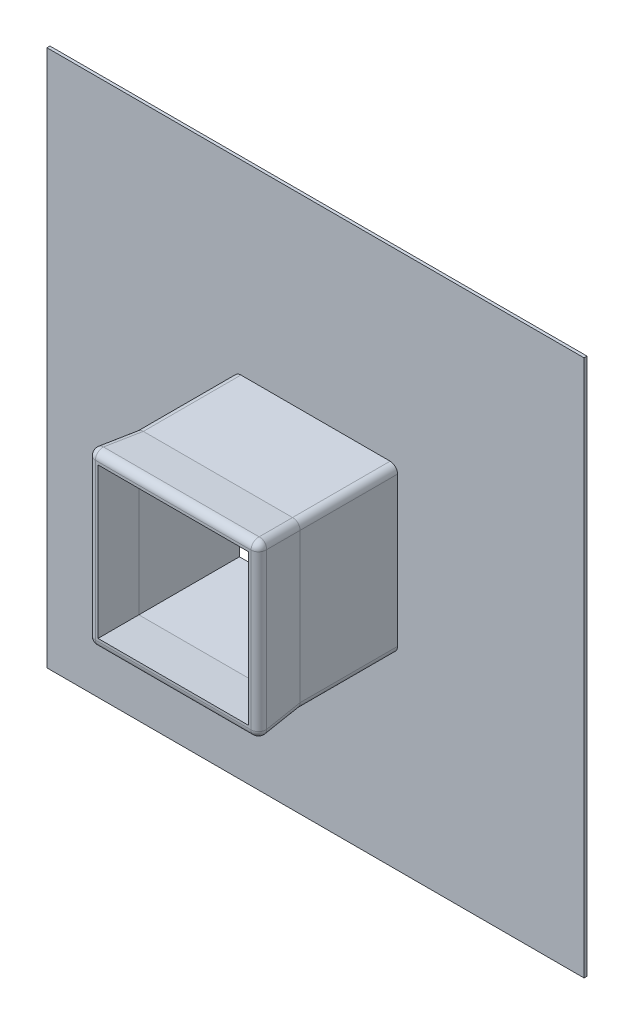
ISO-10303-21;
HEADER;
FILE_DESCRIPTION(('STEP AP214'),'2;1');
FILE_NAME('part.step','',(''),(''),'','','');
FILE_SCHEMA(('AUTOMOTIVE_DESIGN { 1 0 10303 214 1 1 1 1 }'));
ENDSEC;
DATA;
#1=APPLICATION_CONTEXT('core data for automotive mechanical design processes');
#2=APPLICATION_PROTOCOL_DEFINITION('international standard','automotive_design',2000,#1);
#3=PRODUCT_CONTEXT('',#1,'mechanical');
#4=PRODUCT('Part','Part','',(#3));
#5=PRODUCT_RELATED_PRODUCT_CATEGORY('part','',(#4));
#6=PRODUCT_DEFINITION_FORMATION('','',#4);
#7=PRODUCT_DEFINITION_CONTEXT('part definition',#1,'design');
#8=PRODUCT_DEFINITION('design','',#6,#7);
#9=PRODUCT_DEFINITION_SHAPE('','',#8);
#10=(LENGTH_UNIT() NAMED_UNIT(*) SI_UNIT(.MILLI.,.METRE.));
#11=(NAMED_UNIT(*) PLANE_ANGLE_UNIT() SI_UNIT($,.RADIAN.));
#12=(NAMED_UNIT(*) SI_UNIT($,.STERADIAN.) SOLID_ANGLE_UNIT());
#13=UNCERTAINTY_MEASURE_WITH_UNIT(LENGTH_MEASURE(1.E-05),#10,'distance_accuracy_value','');
#14=(GEOMETRIC_REPRESENTATION_CONTEXT(3) GLOBAL_UNCERTAINTY_ASSIGNED_CONTEXT((#13)) GLOBAL_UNIT_ASSIGNED_CONTEXT((#10,
#11,#12)) REPRESENTATION_CONTEXT('',''));
#15=CARTESIAN_POINT('',(0.,0.,0.));
#16=DIRECTION('',(0.,0.,1.));
#17=DIRECTION('',(1.,0.,0.));
#18=AXIS2_PLACEMENT_3D('',#15,#16,#17);
#19=CARTESIAN_POINT('',(-9.386230559438,-9.38623055943905,38.2643458776388));
#20=DIRECTION('',(1.,0.,0.));
#21=DIRECTION('',(0.,0.,-1.));
#22=AXIS2_PLACEMENT_3D('',#19,#20,#21);
#23=PLANE('',#22);
#24=DIRECTION('',(0.,-1.,0.));
#25=VECTOR('',#24,1.);
#26=CARTESIAN_POINT('',(-9.386230559438,-9.38623055943905,36.2643458776388));
#27=LINE('',#26,#25);
#28=CARTESIAN_POINT('',(-9.386230559438,350.613769439746,36.2643458776388));
#29=VERTEX_POINT('',#28);
#30=CARTESIAN_POINT('',(-9.386230559438,-9.38623055943905,36.2643458776388));
#31=VERTEX_POINT('',#30);
#32=EDGE_CURVE('E282',#29,#31,#27,.T.);
#33=ORIENTED_EDGE('',*,*,#32,.T.);
#34=DIRECTION('',(0.,0.,-1.));
#35=VECTOR('',#34,1.);
#36=CARTESIAN_POINT('',(-9.386230559438,-9.38623055943905,38.2643458776388));
#37=LINE('',#36,#35);
#38=CARTESIAN_POINT('',(-9.386230559438,-9.38623055943905,38.2643458776388));
#39=VERTEX_POINT('',#38);
#40=EDGE_CURVE('E309',#39,#31,#37,.T.);
#41=ORIENTED_EDGE('',*,*,#40,.F.);
#42=DIRECTION('',(0.,-1.,0.));
#43=VECTOR('',#42,1.);
#44=CARTESIAN_POINT('',(-9.386230559438,-9.38623055943905,38.2643458776388));
#45=LINE('',#44,#43);
#46=CARTESIAN_POINT('',(-9.386230559438,350.613769439746,38.2643458776388));
#47=VERTEX_POINT('',#46);
#48=EDGE_CURVE('E283',#47,#39,#45,.T.);
#49=ORIENTED_EDGE('',*,*,#48,.F.);
#50=DIRECTION('',(0.,0.,-1.));
#51=VECTOR('',#50,1.);
#52=CARTESIAN_POINT('',(-9.386230559438,350.613769439746,38.2643458776388));
#53=LINE('',#52,#51);
#54=EDGE_CURVE('E293',#47,#29,#53,.T.);
#55=ORIENTED_EDGE('',*,*,#54,.T.);
#56=EDGE_LOOP('',(#33,#41,#49,#55));
#57=FACE_BOUND('',#56,.T.);
#58=ADVANCED_FACE('F39',(#57),#23,.F.);
#59=CARTESIAN_POINT('',(-9.386230559438,-9.38623055943905,38.2643458776388));
#60=DIRECTION('',(0.,1.,0.));
#61=DIRECTION('',(0.,0.,1.));
#62=AXIS2_PLACEMENT_3D('',#59,#60,#61);
#63=PLANE('',#62);
#64=DIRECTION('',(1.,0.,0.));
#65=VECTOR('',#64,1.);
#66=CARTESIAN_POINT('',(-9.386230559438,-9.38623055943905,36.2643458776388));
#67=LINE('',#66,#65);
#68=CARTESIAN_POINT('',(350.613769439747,-9.38623055943905,36.2643458776388));
#69=VERTEX_POINT('',#68);
#70=EDGE_CURVE('E296',#31,#69,#67,.T.);
#71=ORIENTED_EDGE('',*,*,#70,.T.);
#72=DIRECTION('',(0.,0.,-1.));
#73=VECTOR('',#72,1.);
#74=CARTESIAN_POINT('',(350.613769439747,-9.38623055943905,38.2643458776388));
#75=LINE('',#74,#73);
#76=CARTESIAN_POINT('',(350.613769439747,-9.38623055943905,38.2643458776388));
#77=VERTEX_POINT('',#76);
#78=EDGE_CURVE('E306',#77,#69,#75,.T.);
#79=ORIENTED_EDGE('',*,*,#78,.F.);
#80=DIRECTION('',(1.,0.,0.));
#81=VECTOR('',#80,1.);
#82=CARTESIAN_POINT('',(-9.386230559438,-9.38623055943905,38.2643458776388));
#83=LINE('',#82,#81);
#84=EDGE_CURVE('E286',#39,#77,#83,.T.);
#85=ORIENTED_EDGE('',*,*,#84,.F.);
#86=ORIENTED_EDGE('',*,*,#40,.T.);
#87=EDGE_LOOP('',(#71,#79,#85,#86));
#88=FACE_BOUND('',#87,.T.);
#89=ADVANCED_FACE('F559',(#88),#63,.F.);
#90=CARTESIAN_POINT('',(350.613769439747,-9.38623055943905,38.2643458776388));
#91=DIRECTION('',(-1.,0.,0.));
#92=DIRECTION('',(0.,0.,1.));
#93=AXIS2_PLACEMENT_3D('',#90,#91,#92);
#94=PLANE('',#93);
#95=DIRECTION('',(0.,1.,0.));
#96=VECTOR('',#95,1.);
#97=CARTESIAN_POINT('',(350.613769439747,-9.38623055943905,36.2643458776388));
#98=LINE('',#97,#96);
#99=CARTESIAN_POINT('',(350.613769439747,350.613769439746,36.2643458776388));
#100=VERTEX_POINT('',#99);
#101=EDGE_CURVE('E298',#69,#100,#98,.T.);
#102=ORIENTED_EDGE('',*,*,#101,.T.);
#103=DIRECTION('',(0.,0.,-1.));
#104=VECTOR('',#103,1.);
#105=CARTESIAN_POINT('',(350.613769439747,350.613769439746,38.2643458776388));
#106=LINE('',#105,#104);
#107=CARTESIAN_POINT('',(350.613769439747,350.613769439746,38.2643458776388));
#108=VERTEX_POINT('',#107);
#109=EDGE_CURVE('E303',#108,#100,#106,.T.);
#110=ORIENTED_EDGE('',*,*,#109,.F.);
#111=DIRECTION('',(0.,1.,0.));
#112=VECTOR('',#111,1.);
#113=CARTESIAN_POINT('',(350.613769439747,-9.38623055943905,38.2643458776388));
#114=LINE('',#113,#112);
#115=EDGE_CURVE('E289',#77,#108,#114,.T.);
#116=ORIENTED_EDGE('',*,*,#115,.F.);
#117=ORIENTED_EDGE('',*,*,#78,.T.);
#118=EDGE_LOOP('',(#102,#110,#116,#117));
#119=FACE_BOUND('',#118,.T.);
#120=ADVANCED_FACE('F565',(#119),#94,.F.);
#121=CARTESIAN_POINT('',(-9.386230559438,350.613769439746,38.2643458776388));
#122=DIRECTION('',(0.,-1.,0.));
#123=DIRECTION('',(0.,0.,-1.));
#124=AXIS2_PLACEMENT_3D('',#121,#122,#123);
#125=PLANE('',#124);
#126=DIRECTION('',(-1.,0.,0.));
#127=VECTOR('',#126,1.);
#128=CARTESIAN_POINT('',(-9.386230559438,350.613769439746,36.2643458776388));
#129=LINE('',#128,#127);
#130=EDGE_CURVE('E287',#100,#29,#129,.T.);
#131=ORIENTED_EDGE('',*,*,#130,.T.);
#132=ORIENTED_EDGE('',*,*,#54,.F.);
#133=DIRECTION('',(-1.,0.,0.));
#134=VECTOR('',#133,1.);
#135=CARTESIAN_POINT('',(-9.386230559438,350.613769439746,38.2643458776388));
#136=LINE('',#135,#134);
#137=EDGE_CURVE('E291',#108,#47,#136,.T.);
#138=ORIENTED_EDGE('',*,*,#137,.F.);
#139=ORIENTED_EDGE('',*,*,#109,.T.);
#140=EDGE_LOOP('',(#131,#132,#138,#139));
#141=FACE_BOUND('',#140,.T.);
#142=ADVANCED_FACE('F747',(#141),#125,.F.);
#143=CARTESIAN_POINT('',(0.,0.,38.2643458776388));
#144=DIRECTION('',(0.,0.,-1.));
#145=DIRECTION('',(-1.,0.,0.));
#146=AXIS2_PLACEMENT_3D('',#143,#144,#145);
#147=PLANE('',#146);
#148=DIRECTION('',(-1.,0.,0.));
#149=VECTOR('',#148,1.);
#150=CARTESIAN_POINT('',(115.613769764681,225.613769439751,38.2643458776388));
#151=LINE('',#150,#149);
#152=CARTESIAN_POINT('',(220.613769764689,225.613769439751,38.2643458776388));
#153=VERTEX_POINT('',#152);
#154=CARTESIAN_POINT('',(120.613769764688,225.613769439751,38.2643458776388));
#155=VERTEX_POINT('',#154);
#156=EDGE_CURVE('E272',#153,#155,#151,.T.);
#157=ORIENTED_EDGE('',*,*,#156,.F.);
#158=CARTESIAN_POINT('',(220.613769764689,220.613769439751,38.2643458776388));
#159=DIRECTION('',(0.,0.,-1.));
#160=DIRECTION('',(-1.,0.,0.));
#161=AXIS2_PLACEMENT_3D('',#158,#159,#160);
#162=CIRCLE('',#161,5.);
#163=CARTESIAN_POINT('',(225.613769764681,220.613769439751,38.2643458776388));
#164=VERTEX_POINT('',#163);
#165=EDGE_CURVE('E398',#153,#164,#162,.T.);
#166=ORIENTED_EDGE('',*,*,#165,.T.);
#167=DIRECTION('',(0.,1.,0.));
#168=VECTOR('',#167,1.);
#169=CARTESIAN_POINT('',(225.613769764681,225.613769439751,38.2643458776388));
#170=LINE('',#169,#168);
#171=CARTESIAN_POINT('',(225.613769764681,120.613769439751,38.2643458776388));
#172=VERTEX_POINT('',#171);
#173=EDGE_CURVE('E269',#172,#164,#170,.T.);
#174=ORIENTED_EDGE('',*,*,#173,.F.);
#175=CARTESIAN_POINT('',(220.613769764689,120.613769439751,38.2643458776388));
#176=DIRECTION('',(0.,0.,-1.));
#177=DIRECTION('',(-1.,0.,0.));
#178=AXIS2_PLACEMENT_3D('',#175,#176,#177);
#179=CIRCLE('',#178,5.);
#180=CARTESIAN_POINT('',(220.613769764689,115.613769439751,38.2643458776388));
#181=VERTEX_POINT('',#180);
#182=EDGE_CURVE('E418',#172,#181,#179,.T.);
#183=ORIENTED_EDGE('',*,*,#182,.T.);
#184=DIRECTION('',(1.,0.,0.));
#185=VECTOR('',#184,1.);
#186=CARTESIAN_POINT('',(115.613769764681,115.613769439751,38.2643458776388));
#187=LINE('',#186,#185);
#188=CARTESIAN_POINT('',(120.613769764688,115.613769439751,38.2643458776388));
#189=VERTEX_POINT('',#188);
#190=EDGE_CURVE('E279',#189,#181,#187,.T.);
#191=ORIENTED_EDGE('',*,*,#190,.F.);
#192=CARTESIAN_POINT('',(120.613769764688,120.613769439751,38.2643458776388));
#193=DIRECTION('',(0.,0.,-1.));
#194=DIRECTION('',(-1.,0.,0.));
#195=AXIS2_PLACEMENT_3D('',#192,#193,#194);
#196=CIRCLE('',#195,5.);
#197=CARTESIAN_POINT('',(115.613769764681,120.613769439751,38.2643458776388));
#198=VERTEX_POINT('',#197);
#199=EDGE_CURVE('E428',#189,#198,#196,.T.);
#200=ORIENTED_EDGE('',*,*,#199,.T.);
#201=DIRECTION('',(0.,-1.,0.));
#202=VECTOR('',#201,1.);
#203=CARTESIAN_POINT('',(115.613769764681,225.613769439751,38.2643458776388));
#204=LINE('',#203,#202);
#205=CARTESIAN_POINT('',(115.613769764681,220.613769439751,38.2643458776388));
#206=VERTEX_POINT('',#205);
#207=EDGE_CURVE('E276',#206,#198,#204,.T.);
#208=ORIENTED_EDGE('',*,*,#207,.F.);
#209=CARTESIAN_POINT('',(120.613769764688,220.613769439751,38.2643458776388));
#210=DIRECTION('',(0.,0.,-1.));
#211=DIRECTION('',(-1.,0.,0.));
#212=AXIS2_PLACEMENT_3D('',#209,#210,#211);
#213=CIRCLE('',#212,5.);
#214=EDGE_CURVE('E408',#206,#155,#213,.T.);
#215=ORIENTED_EDGE('',*,*,#214,.T.);
#216=EDGE_LOOP('',(#157,#166,#174,#183,#191,#200,#208,#215));
#217=FACE_BOUND('',#216,.T.);
#218=ORIENTED_EDGE('',*,*,#48,.T.);
#219=ORIENTED_EDGE('',*,*,#84,.T.);
#220=ORIENTED_EDGE('',*,*,#115,.T.);
#221=ORIENTED_EDGE('',*,*,#137,.T.);
#222=EDGE_LOOP('',(#218,#219,#220,#221));
#223=FACE_BOUND('',#222,.T.);
#224=ADVANCED_FACE('F524',(#217,#223),#147,.F.);
#225=CARTESIAN_POINT('',(0.,0.,36.2643458776388));
#226=DIRECTION('',(0.,0.,-1.));
#227=DIRECTION('',(-1.,0.,0.));
#228=AXIS2_PLACEMENT_3D('',#225,#226,#227);
#229=PLANE('',#228);
#230=ORIENTED_EDGE('',*,*,#32,.F.);
#231=ORIENTED_EDGE('',*,*,#130,.F.);
#232=ORIENTED_EDGE('',*,*,#101,.F.);
#233=ORIENTED_EDGE('',*,*,#70,.F.);
#234=EDGE_LOOP('',(#230,#231,#232,#233));
#235=FACE_BOUND('',#234,.T.);
#236=DIRECTION('',(-1.,0.,0.));
#237=VECTOR('',#236,1.);
#238=CARTESIAN_POINT('',(223.613769764689,117.613769439751,36.2643458776388));
#239=LINE('',#238,#237);
#240=CARTESIAN_POINT('',(223.613769764689,117.613769439751,36.2643458776388));
#241=VERTEX_POINT('',#240);
#242=CARTESIAN_POINT('',(117.613769764688,117.613769439751,36.2643458776388));
#243=VERTEX_POINT('',#242);
#244=EDGE_CURVE('E451',#241,#243,#239,.T.);
#245=ORIENTED_EDGE('',*,*,#244,.F.);
#246=DIRECTION('',(0.,-1.,0.));
#247=VECTOR('',#246,1.);
#248=CARTESIAN_POINT('',(223.613769764689,117.613769439751,36.2643458776388));
#249=LINE('',#248,#247);
#250=CARTESIAN_POINT('',(223.613769764689,223.613769439751,36.2643458776388));
#251=VERTEX_POINT('',#250);
#252=EDGE_CURVE('E245',#251,#241,#249,.T.);
#253=ORIENTED_EDGE('',*,*,#252,.F.);
#254=DIRECTION('',(1.,0.,0.));
#255=VECTOR('',#254,1.);
#256=CARTESIAN_POINT('',(223.613769764689,223.613769439751,36.2643458776388));
#257=LINE('',#256,#255);
#258=CARTESIAN_POINT('',(117.613769764688,223.613769439751,36.2643458776388));
#259=VERTEX_POINT('',#258);
#260=EDGE_CURVE('E255',#259,#251,#257,.T.);
#261=ORIENTED_EDGE('',*,*,#260,.F.);
#262=DIRECTION('',(0.,1.,0.));
#263=VECTOR('',#262,1.);
#264=CARTESIAN_POINT('',(117.613769764688,117.613769439751,36.2643458776388));
#265=LINE('',#264,#263);
#266=EDGE_CURVE('E453',#243,#259,#265,.T.);
#267=ORIENTED_EDGE('',*,*,#266,.F.);
#268=EDGE_LOOP('',(#245,#253,#261,#267));
#269=FACE_BOUND('',#268,.T.);
#270=ADVANCED_FACE('F467',(#235,#269),#229,.T.);
#271=CARTESIAN_POINT('',(225.613769764689,225.613769439751,259.22238606523));
#272=DIRECTION('',(0.,1.,0.));
#273=DIRECTION('',(0.,0.,1.));
#274=AXIS2_PLACEMENT_3D('',#271,#272,#273);
#275=PLANE('',#274);
#276=DIRECTION('',(-1.,0.,0.));
#277=VECTOR('',#276,1.);
#278=CARTESIAN_POINT('',(225.613769764689,225.613769439751,103.658894204189));
#279=LINE('',#278,#277);
#280=CARTESIAN_POINT('',(220.613769764689,225.613769439751,103.658894204189));
#281=VERTEX_POINT('',#280);
#282=CARTESIAN_POINT('',(120.613769764688,225.613769439751,103.658894204189));
#283=VERTEX_POINT('',#282);
#284=EDGE_CURVE('E273',#281,#283,#279,.T.);
#285=ORIENTED_EDGE('',*,*,#284,.F.);
#286=DIRECTION('',(0.,0.,-1.));
#287=VECTOR('',#286,1.);
#288=CARTESIAN_POINT('',(220.613769764689,225.613769439751,259.22238606523));
#289=LINE('',#288,#287);
#290=EDGE_CURVE('E380',#281,#153,#289,.T.);
#291=ORIENTED_EDGE('',*,*,#290,.T.);
#292=ORIENTED_EDGE('',*,*,#156,.T.);
#293=DIRECTION('',(0.,0.,-1.));
#294=VECTOR('',#293,1.);
#295=CARTESIAN_POINT('',(120.613769764688,225.613769439751,259.22238606523));
#296=LINE('',#295,#294);
#297=EDGE_CURVE('E344',#155,#283,#296,.F.);
#298=ORIENTED_EDGE('',*,*,#297,.T.);
#299=EDGE_LOOP('',(#285,#291,#292,#298));
#300=FACE_BOUND('',#299,.T.);
#301=ADVANCED_FACE('F522',(#300),#275,.T.);
#302=CARTESIAN_POINT('',(225.613769764689,115.613769439751,259.22238606523));
#303=DIRECTION('',(0.,-1.,0.));
#304=DIRECTION('',(0.,0.,-1.));
#305=AXIS2_PLACEMENT_3D('',#302,#303,#304);
#306=PLANE('',#305);
#307=ORIENTED_EDGE('',*,*,#190,.T.);
#308=DIRECTION('',(0.,0.,-1.));
#309=VECTOR('',#308,1.);
#310=CARTESIAN_POINT('',(220.613769764689,115.613769439751,259.22238606523));
#311=LINE('',#310,#309);
#312=CARTESIAN_POINT('',(220.613769764689,115.613769439751,103.658894204189));
#313=VERTEX_POINT('',#312);
#314=EDGE_CURVE('E396',#181,#313,#311,.F.);
#315=ORIENTED_EDGE('',*,*,#314,.T.);
#316=DIRECTION('',(1.,0.,0.));
#317=VECTOR('',#316,1.);
#318=CARTESIAN_POINT('',(225.613769764689,115.613769439751,103.658894204189));
#319=LINE('',#318,#317);
#320=CARTESIAN_POINT('',(120.613769764688,115.613769439751,103.658894204189));
#321=VERTEX_POINT('',#320);
#322=EDGE_CURVE('E263',#321,#313,#319,.T.);
#323=ORIENTED_EDGE('',*,*,#322,.F.);
#324=DIRECTION('',(0.,0.,-1.));
#325=VECTOR('',#324,1.);
#326=CARTESIAN_POINT('',(120.613769764688,115.613769439751,259.22238606523));
#327=LINE('',#326,#325);
#328=EDGE_CURVE('E393',#321,#189,#327,.T.);
#329=ORIENTED_EDGE('',*,*,#328,.T.);
#330=EDGE_LOOP('',(#307,#315,#323,#329));
#331=FACE_BOUND('',#330,.T.);
#332=ADVANCED_FACE('F442',(#331),#306,.T.);
#333=CARTESIAN_POINT('',(225.613769764689,115.613769439751,259.22238606523));
#334=DIRECTION('',(1.,0.,0.));
#335=DIRECTION('',(0.,0.,-1.));
#336=AXIS2_PLACEMENT_3D('',#333,#334,#335);
#337=PLANE('',#336);
#338=ORIENTED_EDGE('',*,*,#173,.T.);
#339=DIRECTION('',(0.,0.,-1.));
#340=VECTOR('',#339,1.);
#341=CARTESIAN_POINT('',(225.613769764689,220.613769439751,259.22238606523));
#342=LINE('',#341,#340);
#343=CARTESIAN_POINT('',(225.613769764689,220.613769439751,103.658894204189));
#344=VERTEX_POINT('',#343);
#345=EDGE_CURVE('E386',#164,#344,#342,.F.);
#346=ORIENTED_EDGE('',*,*,#345,.T.);
#347=DIRECTION('',(0.,1.,0.));
#348=VECTOR('',#347,1.);
#349=CARTESIAN_POINT('',(225.613769764689,115.613769439751,103.658894204189));
#350=LINE('',#349,#348);
#351=CARTESIAN_POINT('',(225.613769764689,120.613769439751,103.658894204189));
#352=VERTEX_POINT('',#351);
#353=EDGE_CURVE('E259',#352,#344,#350,.T.);
#354=ORIENTED_EDGE('',*,*,#353,.F.);
#355=DIRECTION('',(0.,0.,-1.));
#356=VECTOR('',#355,1.);
#357=CARTESIAN_POINT('',(225.613769764689,120.613769439751,259.22238606523));
#358=LINE('',#357,#356);
#359=EDGE_CURVE('E383',#352,#172,#358,.T.);
#360=ORIENTED_EDGE('',*,*,#359,.T.);
#361=EDGE_LOOP('',(#338,#346,#354,#360));
#362=FACE_BOUND('',#361,.T.);
#363=ADVANCED_FACE('F706',(#362),#337,.T.);
#364=CARTESIAN_POINT('',(115.613769764688,115.613769439751,259.22238606523));
#365=DIRECTION('',(-1.,0.,0.));
#366=DIRECTION('',(0.,-1.,0.));
#367=AXIS2_PLACEMENT_3D('',#364,#365,#366);
#368=PLANE('',#367);
#369=DIRECTION('',(0.,-1.,0.));
#370=VECTOR('',#369,1.);
#371=CARTESIAN_POINT('',(115.613769764688,115.613769439751,103.658894204189));
#372=LINE('',#371,#370);
#373=CARTESIAN_POINT('',(115.613769764688,220.613769439751,103.658894204189));
#374=VERTEX_POINT('',#373);
#375=CARTESIAN_POINT('',(115.613769764688,120.613769439751,103.658894204189));
#376=VERTEX_POINT('',#375);
#377=EDGE_CURVE('E235',#374,#376,#372,.T.);
#378=ORIENTED_EDGE('',*,*,#377,.F.);
#379=DIRECTION('',(0.,0.,-1.));
#380=VECTOR('',#379,1.);
#381=CARTESIAN_POINT('',(115.613769764688,220.613769439751,259.22238606523));
#382=LINE('',#381,#380);
#383=EDGE_CURVE('E390',#374,#206,#382,.T.);
#384=ORIENTED_EDGE('',*,*,#383,.T.);
#385=ORIENTED_EDGE('',*,*,#207,.T.);
#386=DIRECTION('',(0.,0.,-1.));
#387=VECTOR('',#386,1.);
#388=CARTESIAN_POINT('',(115.613769764688,120.613769439751,259.22238606523));
#389=LINE('',#388,#387);
#390=EDGE_CURVE('E388',#198,#376,#389,.F.);
#391=ORIENTED_EDGE('',*,*,#390,.T.);
#392=EDGE_LOOP('',(#378,#384,#385,#391));
#393=FACE_BOUND('',#392,.T.);
#394=ADVANCED_FACE('F530',(#393),#368,.T.);
#395=CARTESIAN_POINT('',(223.613769764689,117.613769439751,259.22238606523));
#396=DIRECTION('',(0.,-1.,0.));
#397=DIRECTION('',(0.,0.,-1.));
#398=AXIS2_PLACEMENT_3D('',#395,#396,#397);
#399=PLANE('',#398);
#400=DIRECTION('',(0.,0.,-1.));
#401=VECTOR('',#400,1.);
#402=CARTESIAN_POINT('',(117.613769764688,117.613769439751,259.22238606523));
#403=LINE('',#402,#401);
#404=CARTESIAN_POINT('',(117.613769764688,117.613769439751,103.658894204189));
#405=VERTEX_POINT('',#404);
#406=EDGE_CURVE('E254',#405,#243,#403,.T.);
#407=ORIENTED_EDGE('',*,*,#406,.F.);
#408=DIRECTION('',(1.,0.,0.));
#409=VECTOR('',#408,1.);
#410=CARTESIAN_POINT('',(223.613769764689,117.613769439751,103.658894204189));
#411=LINE('',#410,#409);
#412=CARTESIAN_POINT('',(223.613769764689,117.613769439751,103.658894204189));
#413=VERTEX_POINT('',#412);
#414=EDGE_CURVE('E241',#405,#413,#411,.T.);
#415=ORIENTED_EDGE('',*,*,#414,.T.);
#416=DIRECTION('',(0.,0.,-1.));
#417=VECTOR('',#416,1.);
#418=CARTESIAN_POINT('',(223.613769764689,117.613769439751,259.22238606523));
#419=LINE('',#418,#417);
#420=EDGE_CURVE('E248',#413,#241,#419,.T.);
#421=ORIENTED_EDGE('',*,*,#420,.T.);
#422=ORIENTED_EDGE('',*,*,#244,.T.);
#423=EDGE_LOOP('',(#407,#415,#421,#422));
#424=FACE_BOUND('',#423,.T.);
#425=ADVANCED_FACE('F258',(#424),#399,.F.);
#426=CARTESIAN_POINT('',(117.613769764688,117.613769439751,259.22238606523));
#427=DIRECTION('',(-1.,0.,0.));
#428=DIRECTION('',(0.,0.,1.));
#429=AXIS2_PLACEMENT_3D('',#426,#427,#428);
#430=PLANE('',#429);
#431=DIRECTION('',(0.,0.,-1.));
#432=VECTOR('',#431,1.);
#433=CARTESIAN_POINT('',(117.613769764688,223.613769439751,259.22238606523));
#434=LINE('',#433,#432);
#435=CARTESIAN_POINT('',(117.613769764688,223.613769439751,103.658894204189));
#436=VERTEX_POINT('',#435);
#437=EDGE_CURVE('E265',#436,#259,#434,.T.);
#438=ORIENTED_EDGE('',*,*,#437,.F.);
#439=DIRECTION('',(0.,-1.,0.));
#440=VECTOR('',#439,1.);
#441=CARTESIAN_POINT('',(117.613769764688,117.613769439751,103.658894204189));
#442=LINE('',#441,#440);
#443=EDGE_CURVE('E465',#436,#405,#442,.T.);
#444=ORIENTED_EDGE('',*,*,#443,.T.);
#445=ORIENTED_EDGE('',*,*,#406,.T.);
#446=ORIENTED_EDGE('',*,*,#266,.T.);
#447=EDGE_LOOP('',(#438,#444,#445,#446));
#448=FACE_BOUND('',#447,.T.);
#449=ADVANCED_FACE('F461',(#448),#430,.F.);
#450=CARTESIAN_POINT('',(223.613769764689,223.613769439751,259.22238606523));
#451=DIRECTION('',(0.,1.,0.));
#452=DIRECTION('',(0.,0.,1.));
#453=AXIS2_PLACEMENT_3D('',#450,#451,#452);
#454=PLANE('',#453);
#455=DIRECTION('',(0.,0.,-1.));
#456=VECTOR('',#455,1.);
#457=CARTESIAN_POINT('',(223.613769764689,223.613769439751,259.22238606523));
#458=LINE('',#457,#456);
#459=CARTESIAN_POINT('',(223.613769764689,223.613769439751,103.658894204189));
#460=VERTEX_POINT('',#459);
#461=EDGE_CURVE('E260',#460,#251,#458,.T.);
#462=ORIENTED_EDGE('',*,*,#461,.F.);
#463=DIRECTION('',(-1.,0.,0.));
#464=VECTOR('',#463,1.);
#465=CARTESIAN_POINT('',(223.613769764689,223.613769439751,103.658894204189));
#466=LINE('',#465,#464);
#467=EDGE_CURVE('E234',#460,#436,#466,.T.);
#468=ORIENTED_EDGE('',*,*,#467,.T.);
#469=ORIENTED_EDGE('',*,*,#437,.T.);
#470=ORIENTED_EDGE('',*,*,#260,.T.);
#471=EDGE_LOOP('',(#462,#468,#469,#470));
#472=FACE_BOUND('',#471,.T.);
#473=ADVANCED_FACE('F469',(#472),#454,.F.);
#474=CARTESIAN_POINT('',(223.613769764689,117.613769439751,259.22238606523));
#475=DIRECTION('',(1.,0.,0.));
#476=DIRECTION('',(0.,0.,-1.));
#477=AXIS2_PLACEMENT_3D('',#474,#475,#476);
#478=PLANE('',#477);
#479=ORIENTED_EDGE('',*,*,#420,.F.);
#480=DIRECTION('',(0.,1.,0.));
#481=VECTOR('',#480,1.);
#482=CARTESIAN_POINT('',(223.613769764689,117.613769439751,103.658894204189));
#483=LINE('',#482,#481);
#484=EDGE_CURVE('E224',#413,#460,#483,.T.);
#485=ORIENTED_EDGE('',*,*,#484,.T.);
#486=ORIENTED_EDGE('',*,*,#461,.T.);
#487=ORIENTED_EDGE('',*,*,#252,.T.);
#488=EDGE_LOOP('',(#479,#485,#486,#487));
#489=FACE_BOUND('',#488,.T.);
#490=ADVANCED_FACE('F249',(#489),#478,.F.);
#491=CARTESIAN_POINT('',(0.,0.,133.658894204189));
#492=DIRECTION('',(0.,0.,1.));
#493=DIRECTION('',(1.,0.,0.));
#494=AXIS2_PLACEMENT_3D('',#491,#492,#493);
#495=PLANE('',#494);
#496=DIRECTION('',(-1.,0.,0.));
#497=VECTOR('',#496,1.);
#498=CARTESIAN_POINT('',(228.238429670467,118.44565203932,133.658894204189));
#499=LINE('',#498,#497);
#500=CARTESIAN_POINT('',(118.445652364256,118.44565203932,133.658894204189));
#501=VERTEX_POINT('',#500);
#502=CARTESIAN_POINT('',(222.78188716512,118.44565203932,133.658894204189));
#503=VERTEX_POINT('',#502);
#504=EDGE_CURVE('E312',#501,#503,#499,.F.);
#505=ORIENTED_EDGE('',*,*,#504,.T.);
#506=DIRECTION('',(0.,-1.,0.));
#507=VECTOR('',#506,1.);
#508=CARTESIAN_POINT('',(222.78188716512,228.238429345529,133.658894204189));
#509=LINE('',#508,#507);
#510=CARTESIAN_POINT('',(222.78188716512,222.781886840182,133.658894204189));
#511=VERTEX_POINT('',#510);
#512=EDGE_CURVE('E318',#503,#511,#509,.F.);
#513=ORIENTED_EDGE('',*,*,#512,.T.);
#514=DIRECTION('',(1.,0.,0.));
#515=VECTOR('',#514,1.);
#516=CARTESIAN_POINT('',(112.989109858911,222.781886840182,133.658894204189));
#517=LINE('',#516,#515);
#518=CARTESIAN_POINT('',(118.445652364257,222.781886840182,133.658894204189));
#519=VERTEX_POINT('',#518);
#520=EDGE_CURVE('E316',#511,#519,#517,.F.);
#521=ORIENTED_EDGE('',*,*,#520,.T.);
#522=DIRECTION('',(0.,1.,0.));
#523=VECTOR('',#522,1.);
#524=CARTESIAN_POINT('',(118.445652364256,112.989109533973,133.658894204189));
#525=LINE('',#524,#523);
#526=EDGE_CURVE('E314',#519,#501,#525,.F.);
#527=ORIENTED_EDGE('',*,*,#526,.T.);
#528=EDGE_LOOP('',(#505,#513,#521,#527));
#529=FACE_BOUND('',#528,.T.);
#530=DIRECTION('',(0.,1.,0.));
#531=VECTOR('',#530,1.);
#532=CARTESIAN_POINT('',(220.989109858911,117.613769439751,133.658894204189));
#533=LINE('',#532,#531);
#534=CARTESIAN_POINT('',(220.989109858911,120.238429345529,133.658894204189));
#535=VERTEX_POINT('',#534);
#536=CARTESIAN_POINT('',(220.989109858911,220.989109533973,133.658894204189));
#537=VERTEX_POINT('',#536);
#538=EDGE_CURVE('E983',#535,#537,#533,.T.);
#539=ORIENTED_EDGE('',*,*,#538,.F.);
#540=DIRECTION('',(1.,0.,0.));
#541=VECTOR('',#540,1.);
#542=CARTESIAN_POINT('',(117.613769764688,120.238429345529,133.658894204189));
#543=LINE('',#542,#541);
#544=CARTESIAN_POINT('',(120.238429670465,120.238429345529,133.658894204189));
#545=VERTEX_POINT('',#544);
#546=EDGE_CURVE('E244',#545,#535,#543,.T.);
#547=ORIENTED_EDGE('',*,*,#546,.F.);
#548=DIRECTION('',(0.,-1.,0.));
#549=VECTOR('',#548,1.);
#550=CARTESIAN_POINT('',(120.238429670465,223.613769439751,133.658894204189));
#551=LINE('',#550,#549);
#552=CARTESIAN_POINT('',(120.238429670465,220.989109533973,133.658894204189));
#553=VERTEX_POINT('',#552);
#554=EDGE_CURVE('E976',#553,#545,#551,.T.);
#555=ORIENTED_EDGE('',*,*,#554,.F.);
#556=DIRECTION('',(-1.,0.,0.));
#557=VECTOR('',#556,1.);
#558=CARTESIAN_POINT('',(223.613769764689,220.989109533973,133.658894204189));
#559=LINE('',#558,#557);
#560=EDGE_CURVE('E979',#537,#553,#559,.T.);
#561=ORIENTED_EDGE('',*,*,#560,.F.);
#562=EDGE_LOOP('',(#539,#547,#555,#561));
#563=FACE_BOUND('',#562,.T.);
#564=ADVANCED_FACE('F694',(#529,#563),#495,.T.);
#565=CARTESIAN_POINT('',(225.613769764689,225.613769439751,103.658894204189));
#566=DIRECTION('',(0.,0.996194698091746,-0.0871557427476584));
#567=DIRECTION('',(0.,0.0871557427476584,0.996194698091746));
#568=AXIS2_PLACEMENT_3D('',#565,#566,#567);
#569=PLANE('',#568);
#570=DIRECTION('',(-1.,0.,0.));
#571=VECTOR('',#570,1.);
#572=CARTESIAN_POINT('',(228.238429670467,227.762860330641,128.223115490451));
#573=LINE('',#572,#571);
#574=CARTESIAN_POINT('',(118.445652364257,227.762860330641,128.223115490451));
#575=VERTEX_POINT('',#574);
#576=CARTESIAN_POINT('',(222.78188716512,227.762860330641,128.223115490451));
#577=VERTEX_POINT('',#576);
#578=EDGE_CURVE('E330',#575,#577,#573,.F.);
#579=ORIENTED_EDGE('',*,*,#578,.T.);
#580=DIRECTION('',(0.0868265938642478,0.0868265938642478,0.992432509138967));
#581=VECTOR('',#580,1.);
#582=CARTESIAN_POINT('',(220.670347123098,225.651320288619,104.088102370764));
#583=LINE('',#582,#581);
#584=CARTESIAN_POINT('',(220.632760210397,225.613733375918,103.658481992693));
#585=VERTEX_POINT('',#584);
#586=EDGE_CURVE('E332',#577,#585,#583,.F.);
#587=ORIENTED_EDGE('',*,*,#586,.T.);
#588=CARTESIAN_POINT('',(220.613769764689,220.613769439751,46.5086326903821));
#589=DIRECTION('',(0.,0.996194698091746,-0.0871557427476584));
#590=DIRECTION('',(0.,-0.0871557427476584,-0.996194698091746));
#591=AXIS2_PLACEMENT_3D('',#588,#589,#590);
#592=ELLIPSE('',#591,57.3685662283492,5.);
#593=EDGE_CURVE('E406',#585,#281,#592,.F.);
#594=ORIENTED_EDGE('',*,*,#593,.T.);
#595=ORIENTED_EDGE('',*,*,#284,.T.);
#596=CARTESIAN_POINT('',(120.613769764688,220.613769439751,46.5086326903821));
#597=DIRECTION('',(0.,0.996194698091746,-0.0871557427476584));
#598=DIRECTION('',(0.,-0.0871557427476584,-0.996194698091746));
#599=AXIS2_PLACEMENT_3D('',#596,#597,#598);
#600=ELLIPSE('',#599,57.3685662283492,5.);
#601=CARTESIAN_POINT('',(120.59477931898,225.613733375918,103.658481992693));
#602=VERTEX_POINT('',#601);
#603=EDGE_CURVE('E410',#283,#602,#600,.F.);
#604=ORIENTED_EDGE('',*,*,#603,.T.);
#605=DIRECTION('',(-0.0868265938642472,0.0868265938642478,0.992432509138967));
#606=VECTOR('',#605,1.);
#607=CARTESIAN_POINT('',(121.386466720506,224.822045974392,94.6094535858082));
#608=LINE('',#607,#606);
#609=EDGE_CURVE('E328',#602,#575,#608,.T.);
#610=ORIENTED_EDGE('',*,*,#609,.T.);
#611=EDGE_LOOP('',(#579,#587,#594,#595,#604,#610));
#612=FACE_BOUND('',#611,.T.);
#613=ADVANCED_FACE('F479',(#612),#569,.T.);
#614=CARTESIAN_POINT('',(115.613769764688,225.613769439751,103.658894204189));
#615=DIRECTION('',(-0.996194698091746,0.,-0.0871557427476584));
#616=DIRECTION('',(-0.0871557427476584,0.,0.996194698091746));
#617=AXIS2_PLACEMENT_3D('',#614,#615,#616);
#618=PLANE('',#617);
#619=DIRECTION('',(-0.0868265938642472,0.0868265938642478,0.992432509138967));
#620=VECTOR('',#619,1.);
#621=CARTESIAN_POINT('',(115.57621891582,220.67034679816,104.088102370764));
#622=LINE('',#621,#620);
#623=CARTESIAN_POINT('',(113.464678873798,222.781886840182,128.223115490451));
#624=VERTEX_POINT('',#623);
#625=CARTESIAN_POINT('',(115.613805828521,220.632759885459,103.658481992693));
#626=VERTEX_POINT('',#625);
#627=EDGE_CURVE('E334',#624,#626,#622,.F.);
#628=ORIENTED_EDGE('',*,*,#627,.T.);
#629=CARTESIAN_POINT('',(120.613769764688,220.613769439751,46.5086326903821));
#630=DIRECTION('',(-0.996194698091746,0.,-0.0871557427476584));
#631=DIRECTION('',(0.0871557427476584,0.,-0.996194698091746));
#632=AXIS2_PLACEMENT_3D('',#629,#630,#631);
#633=ELLIPSE('',#632,57.3685662283492,5.);
#634=EDGE_CURVE('E416',#626,#374,#633,.F.);
#635=ORIENTED_EDGE('',*,*,#634,.T.);
#636=ORIENTED_EDGE('',*,*,#377,.T.);
#637=CARTESIAN_POINT('',(120.613769764688,120.613769439751,46.5086326903822));
#638=DIRECTION('',(-0.996194698091746,0.,-0.0871557427476584));
#639=DIRECTION('',(0.0871557427476584,0.,-0.996194698091746));
#640=AXIS2_PLACEMENT_3D('',#637,#638,#639);
#641=ELLIPSE('',#640,57.3685662283492,5.);
#642=CARTESIAN_POINT('',(115.61380582852,120.594778994043,103.658481992693));
#643=VERTEX_POINT('',#642);
#644=EDGE_CURVE('E430',#376,#643,#641,.F.);
#645=ORIENTED_EDGE('',*,*,#644,.T.);
#646=DIRECTION('',(-0.0868265938642483,-0.0868265938642478,0.992432509138967));
#647=VECTOR('',#646,1.);
#648=CARTESIAN_POINT('',(116.405493230047,121.386466395569,94.6094535858082));
#649=LINE('',#648,#647);
#650=CARTESIAN_POINT('',(113.464678873798,118.44565203932,128.223115490451));
#651=VERTEX_POINT('',#650);
#652=EDGE_CURVE('E60',#643,#651,#649,.T.);
#653=ORIENTED_EDGE('',*,*,#652,.T.);
#654=DIRECTION('',(0.,-1.,0.));
#655=VECTOR('',#654,1.);
#656=CARTESIAN_POINT('',(113.464678873798,228.238429345529,128.223115490451));
#657=LINE('',#656,#655);
#658=EDGE_CURVE('E336',#651,#624,#657,.F.);
#659=ORIENTED_EDGE('',*,*,#658,.T.);
#660=EDGE_LOOP('',(#628,#635,#636,#645,#653,#659));
#661=FACE_BOUND('',#660,.T.);
#662=ADVANCED_FACE('F533',(#661),#618,.T.);
#663=CARTESIAN_POINT('',(115.613769764688,115.613769439751,103.658894204189));
#664=DIRECTION('',(0.,-0.996194698091746,-0.0871557427476584));
#665=DIRECTION('',(0.,0.0871557427476584,-0.996194698091746));
#666=AXIS2_PLACEMENT_3D('',#663,#664,#665);
#667=PLANE('',#666);
#668=DIRECTION('',(-0.0868265938642484,-0.0868265938642478,0.992432509138967));
#669=VECTOR('',#668,1.);
#670=CARTESIAN_POINT('',(120.557192406278,115.576218590883,104.088102370764));
#671=LINE('',#670,#669);
#672=CARTESIAN_POINT('',(118.445652364256,113.464678548861,128.223115490451));
#673=VERTEX_POINT('',#672);
#674=CARTESIAN_POINT('',(120.594779318979,115.613805503584,103.658481992693));
#675=VERTEX_POINT('',#674);
#676=EDGE_CURVE('E53',#673,#675,#671,.F.);
#677=ORIENTED_EDGE('',*,*,#676,.T.);
#678=CARTESIAN_POINT('',(120.613769764688,120.613769439751,46.5086326903821));
#679=DIRECTION('',(0.,-0.996194698091746,-0.0871557427476584));
#680=DIRECTION('',(0.,0.0871557427476584,-0.996194698091746));
#681=AXIS2_PLACEMENT_3D('',#678,#679,#680);
#682=ELLIPSE('',#681,57.3685662283492,5.);
#683=EDGE_CURVE('E11',#675,#321,#682,.F.);
#684=ORIENTED_EDGE('',*,*,#683,.T.);
#685=ORIENTED_EDGE('',*,*,#322,.T.);
#686=CARTESIAN_POINT('',(220.613769764689,120.613769439751,46.5086326903821));
#687=DIRECTION('',(0.,-0.996194698091746,-0.0871557427476584));
#688=DIRECTION('',(0.,0.0871557427476584,-0.996194698091746));
#689=AXIS2_PLACEMENT_3D('',#686,#687,#688);
#690=ELLIPSE('',#689,57.3685662283492,5.);
#691=CARTESIAN_POINT('',(220.632760210397,115.613805503584,103.658481992693));
#692=VERTEX_POINT('',#691);
#693=EDGE_CURVE('E420',#313,#692,#690,.F.);
#694=ORIENTED_EDGE('',*,*,#693,.T.);
#695=DIRECTION('',(0.0868265938642478,-0.0868265938642478,0.992432509138967));
#696=VECTOR('',#695,1.);
#697=CARTESIAN_POINT('',(219.841072808871,116.40549290511,94.6094535858081));
#698=LINE('',#697,#696);
#699=CARTESIAN_POINT('',(222.78188716512,113.464678548861,128.223115490451));
#700=VERTEX_POINT('',#699);
#701=EDGE_CURVE('E342',#692,#700,#698,.T.);
#702=ORIENTED_EDGE('',*,*,#701,.T.);
#703=DIRECTION('',(1.,0.,0.));
#704=VECTOR('',#703,1.);
#705=CARTESIAN_POINT('',(112.98910985891,113.464678548861,128.223115490451));
#706=LINE('',#705,#704);
#707=EDGE_CURVE('E340',#700,#673,#706,.F.);
#708=ORIENTED_EDGE('',*,*,#707,.T.);
#709=EDGE_LOOP('',(#677,#684,#685,#694,#702,#708));
#710=FACE_BOUND('',#709,.T.);
#711=ADVANCED_FACE('F439',(#710),#667,.T.);
#712=CARTESIAN_POINT('',(225.613769764689,115.613769439751,103.658894204189));
#713=DIRECTION('',(0.996194698091746,0.,-0.0871557427476584));
#714=DIRECTION('',(-0.0871557427476584,0.,-0.996194698091746));
#715=AXIS2_PLACEMENT_3D('',#712,#713,#714);
#716=PLANE('',#715);
#717=DIRECTION('',(0.0868265938642478,-0.0868265938642478,0.992432509138967));
#718=VECTOR('',#717,1.);
#719=CARTESIAN_POINT('',(225.651320613557,120.557192081342,104.088102370764));
#720=LINE('',#719,#718);
#721=CARTESIAN_POINT('',(227.762860655579,118.44565203932,128.223115490451));
#722=VERTEX_POINT('',#721);
#723=CARTESIAN_POINT('',(225.613733700856,120.594778994043,103.658481992693));
#724=VERTEX_POINT('',#723);
#725=EDGE_CURVE('E321',#722,#724,#720,.F.);
#726=ORIENTED_EDGE('',*,*,#725,.T.);
#727=CARTESIAN_POINT('',(220.613769764689,120.613769439751,46.5086326903821));
#728=DIRECTION('',(0.996194698091746,0.,-0.0871557427476584));
#729=DIRECTION('',(-0.0871557427476584,0.,-0.996194698091746));
#730=AXIS2_PLACEMENT_3D('',#727,#728,#729);
#731=ELLIPSE('',#730,57.3685662283492,5.);
#732=EDGE_CURVE('E426',#724,#352,#731,.F.);
#733=ORIENTED_EDGE('',*,*,#732,.T.);
#734=ORIENTED_EDGE('',*,*,#353,.T.);
#735=CARTESIAN_POINT('',(220.613769764689,220.613769439751,46.5086326903821));
#736=DIRECTION('',(0.996194698091746,0.,-0.0871557427476584));
#737=DIRECTION('',(-0.0871557427476584,0.,-0.996194698091746));
#738=AXIS2_PLACEMENT_3D('',#735,#736,#737);
#739=ELLIPSE('',#738,57.3685662283492,5.);
#740=CARTESIAN_POINT('',(225.613733700856,220.632759885459,103.658481992693));
#741=VERTEX_POINT('',#740);
#742=EDGE_CURVE('E400',#344,#741,#739,.F.);
#743=ORIENTED_EDGE('',*,*,#742,.T.);
#744=DIRECTION('',(0.0868265938642478,0.0868265938642478,0.992432509138967));
#745=VECTOR('',#744,1.);
#746=CARTESIAN_POINT('',(224.82204629933,219.841072483933,94.6094535858082));
#747=LINE('',#746,#745);
#748=CARTESIAN_POINT('',(227.762860655579,222.781886840182,128.223115490451));
#749=VERTEX_POINT('',#748);
#750=EDGE_CURVE('E326',#741,#749,#747,.T.);
#751=ORIENTED_EDGE('',*,*,#750,.T.);
#752=DIRECTION('',(0.,1.,0.));
#753=VECTOR('',#752,1.);
#754=CARTESIAN_POINT('',(227.762860655579,112.989109533973,128.223115490451));
#755=LINE('',#754,#753);
#756=EDGE_CURVE('E323',#749,#722,#755,.F.);
#757=ORIENTED_EDGE('',*,*,#756,.T.);
#758=EDGE_LOOP('',(#726,#733,#734,#743,#751,#757));
#759=FACE_BOUND('',#758,.T.);
#760=ADVANCED_FACE('F514',(#759),#716,.T.);
#761=CARTESIAN_POINT('',(117.613769764688,117.613769439751,103.658894204189));
#762=DIRECTION('',(0.,0.996194698091746,-0.0871557427476584));
#763=DIRECTION('',(0.,0.0871557427476584,0.996194698091746));
#764=AXIS2_PLACEMENT_3D('',#761,#762,#763);
#765=PLANE('',#764);
#766=ORIENTED_EDGE('',*,*,#414,.F.);
#767=DIRECTION('',(-0.0868265938642478,-0.0868265938642478,-0.992432509138967));
#768=VECTOR('',#767,1.);
#769=CARTESIAN_POINT('',(117.613769764688,117.613769439751,103.658894204189));
#770=LINE('',#769,#768);
#771=EDGE_CURVE('E974',#545,#405,#770,.T.);
#772=ORIENTED_EDGE('',*,*,#771,.F.);
#773=ORIENTED_EDGE('',*,*,#546,.T.);
#774=DIRECTION('',(0.0868265938642478,-0.0868265938642478,-0.992432509138967));
#775=VECTOR('',#774,1.);
#776=CARTESIAN_POINT('',(223.613769764689,117.613769439751,103.658894204189));
#777=LINE('',#776,#775);
#778=EDGE_CURVE('E227',#535,#413,#777,.T.);
#779=ORIENTED_EDGE('',*,*,#778,.T.);
#780=EDGE_LOOP('',(#766,#772,#773,#779));
#781=FACE_BOUND('',#780,.T.);
#782=ADVANCED_FACE('F238',(#781),#765,.T.);
#783=CARTESIAN_POINT('',(223.613769764689,117.613769439751,103.658894204189));
#784=DIRECTION('',(-0.996194698091746,0.,-0.0871557427476584));
#785=DIRECTION('',(-0.0871557427476584,0.,0.996194698091746));
#786=AXIS2_PLACEMENT_3D('',#783,#784,#785);
#787=PLANE('',#786);
#788=ORIENTED_EDGE('',*,*,#484,.F.);
#789=ORIENTED_EDGE('',*,*,#778,.F.);
#790=ORIENTED_EDGE('',*,*,#538,.T.);
#791=DIRECTION('',(0.0868265938642478,0.0868265938642478,-0.992432509138967));
#792=VECTOR('',#791,1.);
#793=CARTESIAN_POINT('',(223.613769764689,223.613769439751,103.658894204189));
#794=LINE('',#793,#792);
#795=EDGE_CURVE('E230',#537,#460,#794,.T.);
#796=ORIENTED_EDGE('',*,*,#795,.T.);
#797=EDGE_LOOP('',(#788,#789,#790,#796));
#798=FACE_BOUND('',#797,.T.);
#799=ADVANCED_FACE('F226',(#798),#787,.T.);
#800=CARTESIAN_POINT('',(223.613769764689,223.613769439751,103.658894204189));
#801=DIRECTION('',(0.,-0.996194698091746,-0.0871557427476584));
#802=DIRECTION('',(0.,0.0871557427476584,-0.996194698091746));
#803=AXIS2_PLACEMENT_3D('',#800,#801,#802);
#804=PLANE('',#803);
#805=ORIENTED_EDGE('',*,*,#467,.F.);
#806=ORIENTED_EDGE('',*,*,#795,.F.);
#807=ORIENTED_EDGE('',*,*,#560,.T.);
#808=DIRECTION('',(-0.0868265938642478,0.0868265938642478,-0.992432509138967));
#809=VECTOR('',#808,1.);
#810=CARTESIAN_POINT('',(117.613769764688,223.613769439751,103.658894204189));
#811=LINE('',#810,#809);
#812=EDGE_CURVE('E972',#553,#436,#811,.T.);
#813=ORIENTED_EDGE('',*,*,#812,.T.);
#814=EDGE_LOOP('',(#805,#806,#807,#813));
#815=FACE_BOUND('',#814,.T.);
#816=ADVANCED_FACE('F821',(#815),#804,.T.);
#817=CARTESIAN_POINT('',(117.613769764688,223.613769439751,103.658894204189));
#818=DIRECTION('',(0.996194698091746,0.,-0.0871557427476584));
#819=DIRECTION('',(-0.0871557427476584,0.,-0.996194698091746));
#820=AXIS2_PLACEMENT_3D('',#817,#818,#819);
#821=PLANE('',#820);
#822=ORIENTED_EDGE('',*,*,#443,.F.);
#823=ORIENTED_EDGE('',*,*,#812,.F.);
#824=ORIENTED_EDGE('',*,*,#554,.T.);
#825=ORIENTED_EDGE('',*,*,#771,.T.);
#826=EDGE_LOOP('',(#822,#823,#824,#825));
#827=FACE_BOUND('',#826,.T.);
#828=ADVANCED_FACE('F654',(#827),#821,.T.);
#829=CARTESIAN_POINT('',(120.557192406278,120.557192081342,104.523881084502));
#830=DIRECTION('',(0.0868265938642484,0.0868265938642478,-0.992432509138967));
#831=DIRECTION('',(-0.996194698091745,0.,-0.0871557427476589));
#832=AXIS2_PLACEMENT_3D('',#829,#830,#831);
#833=CYLINDRICAL_SURFACE('',#832,5.);
#834=ORIENTED_EDGE('',*,*,#652,.F.);
#835=CARTESIAN_POINT('',(120.613769764688,120.613769439751,103.877198918732));
#836=DIRECTION('',(0.0434956631775889,0.0434956631775886,-0.99810633429985));
#837=DIRECTION('',(-0.705767757328673,-0.705767757328669,-0.0615121567701575));
#838=AXIS2_PLACEMENT_3D('',#835,#836,#837);
#839=ELLIPSE('',#838,5.00948629236723,5.);
#840=EDGE_CURVE('E47',#643,#675,#839,.F.);
#841=ORIENTED_EDGE('',*,*,#840,.T.);
#842=ORIENTED_EDGE('',*,*,#676,.F.);
#843=CARTESIAN_POINT('',(118.445652364256,118.44565203932,128.658894204189));
#844=DIRECTION('',(-0.0868265938642476,-0.0868265938642473,0.992432509138967));
#845=DIRECTION('',(0.996194698091746,0.,0.0871557427476582));
#846=AXIS2_PLACEMENT_3D('',#843,#844,#845);
#847=CIRCLE('',#846,5.);
#848=EDGE_CURVE('E376',#651,#673,#847,.T.);
#849=ORIENTED_EDGE('',*,*,#848,.F.);
#850=EDGE_LOOP('',(#834,#841,#842,#849));
#851=FACE_BOUND('',#850,.T.);
#852=ADVANCED_FACE('F433',(#851),#833,.T.);
#853=CARTESIAN_POINT('',(118.445652364255,-7.77051897945485E-13,128.658894204189));
#854=DIRECTION('',(0.,-1.,0.));
#855=DIRECTION('',(1.,0.,0.));
#856=AXIS2_PLACEMENT_3D('',#853,#854,#855);
#857=CYLINDRICAL_SURFACE('',#856,5.);
#858=CARTESIAN_POINT('',(118.445652364257,222.781886840182,128.658894204189));
#859=DIRECTION('',(0.,1.,0.));
#860=DIRECTION('',(-1.,0.,0.));
#861=AXIS2_PLACEMENT_3D('',#858,#859,#860);
#862=CIRCLE('',#861,5.);
#863=EDGE_CURVE('E370',#624,#519,#862,.T.);
#864=ORIENTED_EDGE('',*,*,#863,.F.);
#865=ORIENTED_EDGE('',*,*,#658,.F.);
#866=CARTESIAN_POINT('',(118.445652364256,118.44565203932,128.658894204189));
#867=DIRECTION('',(0.,-1.,0.));
#868=DIRECTION('',(1.,0.,0.));
#869=AXIS2_PLACEMENT_3D('',#866,#867,#868);
#870=CIRCLE('',#869,5.);
#871=EDGE_CURVE('E373',#501,#651,#870,.T.);
#872=ORIENTED_EDGE('',*,*,#871,.F.);
#873=ORIENTED_EDGE('',*,*,#526,.F.);
#874=EDGE_LOOP('',(#864,#865,#872,#873));
#875=FACE_BOUND('',#874,.T.);
#876=ADVANCED_FACE('F640',(#875),#857,.T.);
#877=CARTESIAN_POINT('',(120.557192406279,220.67034679816,104.523881084502));
#878=DIRECTION('',(0.0868265938642472,-0.0868265938642478,-0.992432509138967));
#879=DIRECTION('',(0.,0.996194698091746,-0.0871557427476584));
#880=AXIS2_PLACEMENT_3D('',#877,#878,#879);
#881=CYLINDRICAL_SURFACE('',#880,5.);
#882=ORIENTED_EDGE('',*,*,#609,.F.);
#883=CARTESIAN_POINT('',(120.613769764688,220.613769439751,103.87719891873));
#884=DIRECTION('',(0.0434956631775883,-0.0434956631775886,-0.99810633429985));
#885=DIRECTION('',(-0.705767757328669,0.705767757328673,-0.0615121567701579));
#886=AXIS2_PLACEMENT_3D('',#883,#884,#885);
#887=ELLIPSE('',#886,5.00948629236723,5.);
#888=EDGE_CURVE('E413',#602,#626,#887,.F.);
#889=ORIENTED_EDGE('',*,*,#888,.T.);
#890=ORIENTED_EDGE('',*,*,#627,.F.);
#891=CARTESIAN_POINT('',(118.445652364257,222.781886840182,128.658894204189));
#892=DIRECTION('',(-0.0868265938642464,0.0868265938642471,0.992432509138967));
#893=DIRECTION('',(0.,-0.996194698091745,0.0871557427476577));
#894=AXIS2_PLACEMENT_3D('',#891,#892,#893);
#895=CIRCLE('',#894,5.);
#896=EDGE_CURVE('E367',#575,#624,#895,.T.);
#897=ORIENTED_EDGE('',*,*,#896,.F.);
#898=EDGE_LOOP('',(#882,#889,#890,#897));
#899=FACE_BOUND('',#898,.T.);
#900=ADVANCED_FACE('F491',(#899),#881,.T.);
#901=CARTESIAN_POINT('',(118.445652364256,118.44565203932,128.658894204189));
#902=DIRECTION('',(0.,0.,1.));
#903=DIRECTION('',(0.,-1.,0.));
#904=AXIS2_PLACEMENT_3D('',#901,#902,#903);
#905=SPHERICAL_SURFACE('',#904,5.);
#906=ORIENTED_EDGE('',*,*,#871,.T.);
#907=ORIENTED_EDGE('',*,*,#848,.T.);
#908=CARTESIAN_POINT('',(118.445652364256,118.44565203932,128.658894204189));
#909=DIRECTION('',(-1.,0.,0.));
#910=DIRECTION('',(0.,0.,1.));
#911=AXIS2_PLACEMENT_3D('',#908,#909,#910);
#912=CIRCLE('',#911,5.);
#913=EDGE_CURVE('E364',#501,#673,#912,.F.);
#914=ORIENTED_EDGE('',*,*,#913,.F.);
#915=EDGE_LOOP('',(#906,#907,#914));
#916=FACE_BOUND('',#915,.T.);
#917=ADVANCED_FACE('F639',(#916),#905,.T.);
#918=CARTESIAN_POINT('',(118.445652364257,222.781886840182,128.658894204189));
#919=DIRECTION('',(0.,0.,1.));
#920=DIRECTION('',(1.,0.,0.));
#921=AXIS2_PLACEMENT_3D('',#918,#919,#920);
#922=SPHERICAL_SURFACE('',#921,5.);
#923=ORIENTED_EDGE('',*,*,#896,.T.);
#924=ORIENTED_EDGE('',*,*,#863,.T.);
#925=CARTESIAN_POINT('',(118.445652364257,222.781886840182,128.658894204189));
#926=DIRECTION('',(-1.,0.,0.));
#927=DIRECTION('',(0.,-1.,0.));
#928=AXIS2_PLACEMENT_3D('',#925,#926,#927);
#929=CIRCLE('',#928,5.);
#930=EDGE_CURVE('E361',#575,#519,#929,.F.);
#931=ORIENTED_EDGE('',*,*,#930,.F.);
#932=EDGE_LOOP('',(#923,#924,#931));
#933=FACE_BOUND('',#932,.T.);
#934=ADVANCED_FACE('F625',(#933),#922,.T.);
#935=CARTESIAN_POINT('',(220.670347123098,120.557192081342,104.523881084502));
#936=DIRECTION('',(-0.0868265938642478,0.0868265938642478,-0.992432509138967));
#937=DIRECTION('',(-0.996194698091746,0.,0.0871557427476584));
#938=AXIS2_PLACEMENT_3D('',#935,#936,#937);
#939=CYLINDRICAL_SURFACE('',#938,5.);
#940=ORIENTED_EDGE('',*,*,#701,.F.);
#941=CARTESIAN_POINT('',(220.613769764689,120.613769439751,103.877198918731));
#942=DIRECTION('',(-0.0434956631775886,0.0434956631775886,-0.99810633429985));
#943=DIRECTION('',(0.705767757328671,-0.705767757328671,-0.0615121567701577));
#944=AXIS2_PLACEMENT_3D('',#941,#942,#943);
#945=ELLIPSE('',#944,5.00948629236723,5.);
#946=EDGE_CURVE('E423',#692,#724,#945,.F.);
#947=ORIENTED_EDGE('',*,*,#946,.T.);
#948=ORIENTED_EDGE('',*,*,#725,.F.);
#949=CARTESIAN_POINT('',(222.78188716512,118.44565203932,128.658894204189));
#950=DIRECTION('',(0.0868265938642471,-0.0868265938642471,0.992432509138967));
#951=DIRECTION('',(0.996194698091745,0.,-0.0871557427476577));
#952=AXIS2_PLACEMENT_3D('',#949,#950,#951);
#953=CIRCLE('',#952,5.);
#954=EDGE_CURVE('E358',#700,#722,#953,.T.);
#955=ORIENTED_EDGE('',*,*,#954,.F.);
#956=EDGE_LOOP('',(#940,#947,#948,#955));
#957=FACE_BOUND('',#956,.T.);
#958=ADVANCED_FACE('F547',(#957),#939,.T.);
#959=CARTESIAN_POINT('',(0.,118.44565203932,128.658894204189));
#960=DIRECTION('',(1.,0.,0.));
#961=DIRECTION('',(0.,0.,-1.));
#962=AXIS2_PLACEMENT_3D('',#959,#960,#961);
#963=CYLINDRICAL_SURFACE('',#962,5.);
#964=ORIENTED_EDGE('',*,*,#913,.T.);
#965=ORIENTED_EDGE('',*,*,#707,.F.);
#966=CARTESIAN_POINT('',(222.78188716512,118.44565203932,128.658894204189));
#967=DIRECTION('',(1.,0.,0.));
#968=DIRECTION('',(0.,0.,-1.));
#969=AXIS2_PLACEMENT_3D('',#966,#967,#968);
#970=CIRCLE('',#969,5.);
#971=EDGE_CURVE('E355',#503,#700,#970,.T.);
#972=ORIENTED_EDGE('',*,*,#971,.F.);
#973=ORIENTED_EDGE('',*,*,#504,.F.);
#974=EDGE_LOOP('',(#964,#965,#972,#973));
#975=FACE_BOUND('',#974,.T.);
#976=ADVANCED_FACE('F544',(#975),#963,.T.);
#977=CARTESIAN_POINT('',(0.,222.781886840182,128.658894204189));
#978=DIRECTION('',(-1.,0.,0.));
#979=DIRECTION('',(0.,0.,1.));
#980=AXIS2_PLACEMENT_3D('',#977,#978,#979);
#981=CYLINDRICAL_SURFACE('',#980,5.);
#982=ORIENTED_EDGE('',*,*,#930,.T.);
#983=ORIENTED_EDGE('',*,*,#520,.F.);
#984=CARTESIAN_POINT('',(222.78188716512,222.781886840182,128.658894204189));
#985=DIRECTION('',(1.,0.,0.));
#986=DIRECTION('',(0.,0.,-1.));
#987=AXIS2_PLACEMENT_3D('',#984,#985,#986);
#988=CIRCLE('',#987,5.);
#989=EDGE_CURVE('E352',#577,#511,#988,.T.);
#990=ORIENTED_EDGE('',*,*,#989,.F.);
#991=ORIENTED_EDGE('',*,*,#578,.F.);
#992=EDGE_LOOP('',(#982,#983,#990,#991));
#993=FACE_BOUND('',#992,.T.);
#994=ADVANCED_FACE('F505',(#993),#981,.T.);
#995=CARTESIAN_POINT('',(220.670347123098,220.67034679816,104.523881084502));
#996=DIRECTION('',(-0.0868265938642478,-0.0868265938642478,-0.992432509138967));
#997=DIRECTION('',(-0.996194698091746,0.,0.0871557427476584));
#998=AXIS2_PLACEMENT_3D('',#995,#996,#997);
#999=CYLINDRICAL_SURFACE('',#998,5.);
#1000=ORIENTED_EDGE('',*,*,#750,.F.);
#1001=CARTESIAN_POINT('',(220.613769764689,220.613769439751,103.877198918731));
#1002=DIRECTION('',(-0.0434956631775886,-0.0434956631775886,-0.99810633429985));
#1003=DIRECTION('',(0.705767757328671,0.705767757328671,-0.0615121567701577));
#1004=AXIS2_PLACEMENT_3D('',#1001,#1002,#1003);
#1005=ELLIPSE('',#1004,5.00948629236723,5.);
#1006=EDGE_CURVE('E403',#741,#585,#1005,.F.);
#1007=ORIENTED_EDGE('',*,*,#1006,.T.);
#1008=ORIENTED_EDGE('',*,*,#586,.F.);
#1009=CARTESIAN_POINT('',(222.78188716512,222.781886840182,128.658894204189));
#1010=DIRECTION('',(0.0868265938642471,0.0868265938642471,0.992432509138967));
#1011=DIRECTION('',(0.996194698091745,0.,-0.0871557427476577));
#1012=AXIS2_PLACEMENT_3D('',#1009,#1010,#1011);
#1013=CIRCLE('',#1012,5.);
#1014=EDGE_CURVE('E349',#749,#577,#1013,.T.);
#1015=ORIENTED_EDGE('',*,*,#1014,.F.);
#1016=EDGE_LOOP('',(#1000,#1007,#1008,#1015));
#1017=FACE_BOUND('',#1016,.T.);
#1018=ADVANCED_FACE('F501',(#1017),#999,.T.);
#1019=CARTESIAN_POINT('',(222.78188716512,118.44565203932,128.658894204189));
#1020=DIRECTION('',(0.,0.,1.));
#1021=DIRECTION('',(0.,-1.,0.));
#1022=AXIS2_PLACEMENT_3D('',#1019,#1020,#1021);
#1023=SPHERICAL_SURFACE('',#1022,5.);
#1024=ORIENTED_EDGE('',*,*,#971,.T.);
#1025=ORIENTED_EDGE('',*,*,#954,.T.);
#1026=CARTESIAN_POINT('',(222.78188716512,118.44565203932,128.658894204189));
#1027=DIRECTION('',(0.,-1.,0.));
#1028=DIRECTION('',(0.,0.,-1.));
#1029=AXIS2_PLACEMENT_3D('',#1026,#1027,#1028);
#1030=CIRCLE('',#1029,5.);
#1031=EDGE_CURVE('E347',#503,#722,#1030,.F.);
#1032=ORIENTED_EDGE('',*,*,#1031,.F.);
#1033=EDGE_LOOP('',(#1024,#1025,#1032));
#1034=FACE_BOUND('',#1033,.T.);
#1035=ADVANCED_FACE('F549',(#1034),#1023,.T.);
#1036=CARTESIAN_POINT('',(222.78188716512,222.781886840182,128.658894204189));
#1037=DIRECTION('',(0.,0.,1.));
#1038=DIRECTION('',(1.,0.,0.));
#1039=AXIS2_PLACEMENT_3D('',#1036,#1037,#1038);
#1040=SPHERICAL_SURFACE('',#1039,5.);
#1041=ORIENTED_EDGE('',*,*,#1014,.T.);
#1042=ORIENTED_EDGE('',*,*,#989,.T.);
#1043=CARTESIAN_POINT('',(222.78188716512,222.781886840182,128.658894204189));
#1044=DIRECTION('',(0.,1.,0.));
#1045=DIRECTION('',(0.,0.,1.));
#1046=AXIS2_PLACEMENT_3D('',#1043,#1044,#1045);
#1047=CIRCLE('',#1046,5.);
#1048=EDGE_CURVE('E345',#749,#511,#1047,.F.);
#1049=ORIENTED_EDGE('',*,*,#1048,.F.);
#1050=EDGE_LOOP('',(#1041,#1042,#1049));
#1051=FACE_BOUND('',#1050,.T.);
#1052=ADVANCED_FACE('F508',(#1051),#1040,.T.);
#1053=CARTESIAN_POINT('',(222.78188716512,0.,128.658894204189));
#1054=DIRECTION('',(0.,1.,0.));
#1055=DIRECTION('',(0.,0.,1.));
#1056=AXIS2_PLACEMENT_3D('',#1053,#1054,#1055);
#1057=CYLINDRICAL_SURFACE('',#1056,5.);
#1058=ORIENTED_EDGE('',*,*,#1031,.T.);
#1059=ORIENTED_EDGE('',*,*,#756,.F.);
#1060=ORIENTED_EDGE('',*,*,#1048,.T.);
#1061=ORIENTED_EDGE('',*,*,#512,.F.);
#1062=EDGE_LOOP('',(#1058,#1059,#1060,#1061));
#1063=FACE_BOUND('',#1062,.T.);
#1064=ADVANCED_FACE('F511',(#1063),#1057,.T.);
#1065=CARTESIAN_POINT('',(220.613769764689,220.613769439751,259.22238606523));
#1066=DIRECTION('',(0.,0.,-1.));
#1067=DIRECTION('',(-1.,0.,0.));
#1068=AXIS2_PLACEMENT_3D('',#1065,#1066,#1067);
#1069=CYLINDRICAL_SURFACE('',#1068,5.);
#1070=ORIENTED_EDGE('',*,*,#742,.F.);
#1071=ORIENTED_EDGE('',*,*,#345,.F.);
#1072=ORIENTED_EDGE('',*,*,#165,.F.);
#1073=ORIENTED_EDGE('',*,*,#290,.F.);
#1074=ORIENTED_EDGE('',*,*,#593,.F.);
#1075=ORIENTED_EDGE('',*,*,#1006,.F.);
#1076=EDGE_LOOP('',(#1070,#1071,#1072,#1073,#1074,#1075));
#1077=FACE_BOUND('',#1076,.T.);
#1078=ADVANCED_FACE('F520',(#1077),#1069,.T.);
#1079=CARTESIAN_POINT('',(120.613769764688,220.613769439751,259.22238606523));
#1080=DIRECTION('',(0.,0.,-1.));
#1081=DIRECTION('',(-1.,0.,0.));
#1082=AXIS2_PLACEMENT_3D('',#1079,#1080,#1081);
#1083=CYLINDRICAL_SURFACE('',#1082,5.);
#1084=ORIENTED_EDGE('',*,*,#603,.F.);
#1085=ORIENTED_EDGE('',*,*,#297,.F.);
#1086=ORIENTED_EDGE('',*,*,#214,.F.);
#1087=ORIENTED_EDGE('',*,*,#383,.F.);
#1088=ORIENTED_EDGE('',*,*,#634,.F.);
#1089=ORIENTED_EDGE('',*,*,#888,.F.);
#1090=EDGE_LOOP('',(#1084,#1085,#1086,#1087,#1088,#1089));
#1091=FACE_BOUND('',#1090,.T.);
#1092=ADVANCED_FACE('F486',(#1091),#1083,.T.);
#1093=CARTESIAN_POINT('',(220.613769764689,120.613769439751,259.22238606523));
#1094=DIRECTION('',(0.,0.,-1.));
#1095=DIRECTION('',(-1.,0.,0.));
#1096=AXIS2_PLACEMENT_3D('',#1093,#1094,#1095);
#1097=CYLINDRICAL_SURFACE('',#1096,5.);
#1098=ORIENTED_EDGE('',*,*,#693,.F.);
#1099=ORIENTED_EDGE('',*,*,#314,.F.);
#1100=ORIENTED_EDGE('',*,*,#182,.F.);
#1101=ORIENTED_EDGE('',*,*,#359,.F.);
#1102=ORIENTED_EDGE('',*,*,#732,.F.);
#1103=ORIENTED_EDGE('',*,*,#946,.F.);
#1104=EDGE_LOOP('',(#1098,#1099,#1100,#1101,#1102,#1103));
#1105=FACE_BOUND('',#1104,.T.);
#1106=ADVANCED_FACE('F535',(#1105),#1097,.T.);
#1107=CARTESIAN_POINT('',(120.613769764688,120.613769439751,259.22238606523));
#1108=DIRECTION('',(0.,0.,-1.));
#1109=DIRECTION('',(-1.,0.,0.));
#1110=AXIS2_PLACEMENT_3D('',#1107,#1108,#1109);
#1111=CYLINDRICAL_SURFACE('',#1110,5.);
#1112=ORIENTED_EDGE('',*,*,#644,.F.);
#1113=ORIENTED_EDGE('',*,*,#390,.F.);
#1114=ORIENTED_EDGE('',*,*,#199,.F.);
#1115=ORIENTED_EDGE('',*,*,#328,.F.);
#1116=ORIENTED_EDGE('',*,*,#683,.F.);
#1117=ORIENTED_EDGE('',*,*,#840,.F.);
#1118=EDGE_LOOP('',(#1112,#1113,#1114,#1115,#1116,#1117));
#1119=FACE_BOUND('',#1118,.T.);
#1120=ADVANCED_FACE('F41',(#1119),#1111,.T.);
#1121=CLOSED_SHELL('',(#58,#89,#120,#142,#224,#270,#301,#332,#363,#394,#425,#449,#473,#490,#564,
#613,#662,#711,#760,#782,#799,#816,#828,#852,#876,#900,#917,#934,#958,#976,#994,#1018,#1035,
#1052,#1064,#1078,#1092,#1106,#1120));
#1122=MANIFOLD_SOLID_BREP('B2',#1121);
#1123=ADVANCED_BREP_SHAPE_REPRESENTATION('',(#18,#1122),#14);
#1124=SHAPE_DEFINITION_REPRESENTATION(#9,#1123);
ENDSEC;
END-ISO-10303-21;
